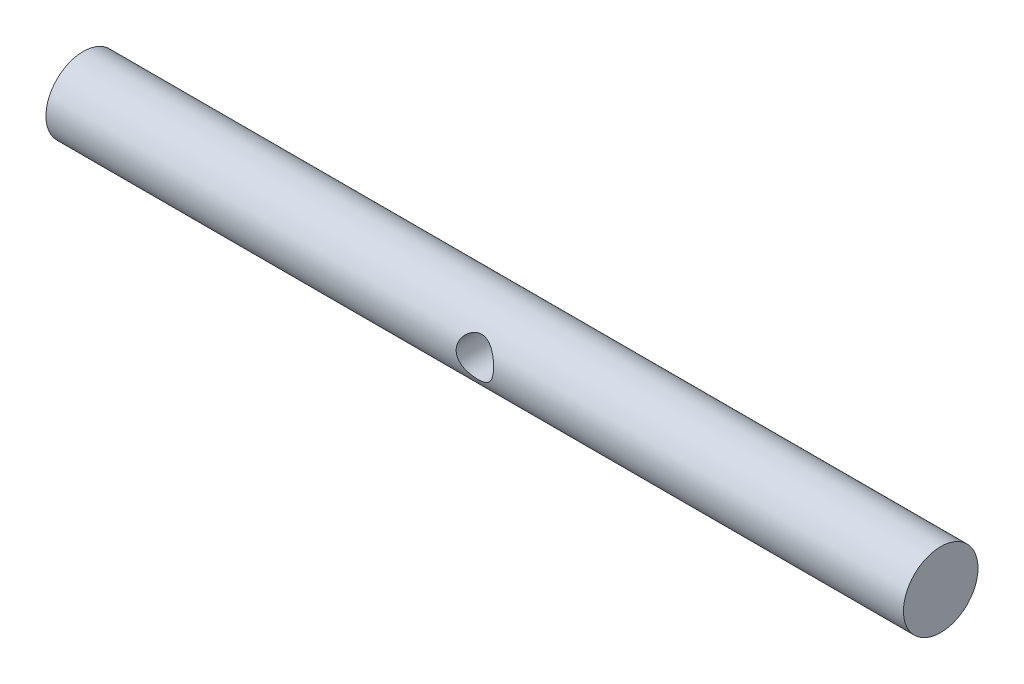
ISO-10303-21;
HEADER;
FILE_DESCRIPTION(('STEP AP214'),'2;1');
FILE_NAME('part.step','',(''),(''),'','','');
FILE_SCHEMA(('AUTOMOTIVE_DESIGN { 1 0 10303 214 1 1 1 1 }'));
ENDSEC;
DATA;
#1=APPLICATION_CONTEXT('core data for automotive mechanical design processes');
#2=APPLICATION_PROTOCOL_DEFINITION('international standard','automotive_design',2000,#1);
#3=PRODUCT_CONTEXT('',#1,'mechanical');
#4=PRODUCT('Part','Part','',(#3));
#5=PRODUCT_RELATED_PRODUCT_CATEGORY('part','',(#4));
#6=PRODUCT_DEFINITION_FORMATION('','',#4);
#7=PRODUCT_DEFINITION_CONTEXT('part definition',#1,'design');
#8=PRODUCT_DEFINITION('design','',#6,#7);
#9=PRODUCT_DEFINITION_SHAPE('','',#8);
#10=(LENGTH_UNIT() NAMED_UNIT(*) SI_UNIT(.MILLI.,.METRE.));
#11=(NAMED_UNIT(*) PLANE_ANGLE_UNIT() SI_UNIT($,.RADIAN.));
#12=(NAMED_UNIT(*) SI_UNIT($,.STERADIAN.) SOLID_ANGLE_UNIT());
#13=UNCERTAINTY_MEASURE_WITH_UNIT(LENGTH_MEASURE(1.E-05),#10,'distance_accuracy_value','');
#14=(GEOMETRIC_REPRESENTATION_CONTEXT(3) GLOBAL_UNCERTAINTY_ASSIGNED_CONTEXT((#13)) GLOBAL_UNIT_ASSIGNED_CONTEXT((#10,
#11,#12)) REPRESENTATION_CONTEXT('',''));
#15=CARTESIAN_POINT('',(0.,0.,0.));
#16=DIRECTION('',(0.,0.,1.));
#17=DIRECTION('',(1.,0.,0.));
#18=AXIS2_PLACEMENT_3D('',#15,#16,#17);
#19=CARTESIAN_POINT('',(292.1,0.,0.));
#20=DIRECTION('',(-1.,0.,0.));
#21=DIRECTION('',(0.,0.,1.));
#22=AXIS2_PLACEMENT_3D('',#19,#20,#21);
#23=CYLINDRICAL_SURFACE('',#22,12.7);
#24=CARTESIAN_POINT('',(292.1,0.,0.));
#25=DIRECTION('',(1.,0.,0.));
#26=DIRECTION('',(0.,0.,-1.));
#27=AXIS2_PLACEMENT_3D('',#24,#25,#26);
#28=CIRCLE('',#27,12.7);
#29=CARTESIAN_POINT('',(292.1,0.,-12.7));
#30=VERTEX_POINT('',#29);
#31=EDGE_CURVE('E45',#30,#30,#28,.T.);
#32=ORIENTED_EDGE('',*,*,#31,.F.);
#33=EDGE_LOOP('',(#32));
#34=FACE_BOUND('',#33,.T.);
#35=CARTESIAN_POINT('',(0.,0.,0.));
#36=DIRECTION('',(1.,0.,0.));
#37=DIRECTION('',(0.,0.,-1.));
#38=AXIS2_PLACEMENT_3D('',#35,#36,#37);
#39=CIRCLE('',#38,12.7);
#40=CARTESIAN_POINT('',(0.,0.,-12.7));
#41=VERTEX_POINT('',#40);
#42=EDGE_CURVE('E49',#41,#41,#39,.T.);
#43=ORIENTED_EDGE('',*,*,#42,.T.);
#44=EDGE_LOOP('',(#43));
#45=FACE_BOUND('',#44,.T.);
#46=CARTESIAN_POINT('',(139.7,1.08538215151732,-12.6535349047279));
#47=CARTESIAN_POINT('',(139.699999058588,1.25646176825175,-12.6388609941093));
#48=CARTESIAN_POINT('',(139.70692032353,1.42722969105797,-12.6207096198575));
#49=CARTESIAN_POINT('',(139.734375824096,1.76687071509261,-12.5776578390939));
#50=CARTESIAN_POINT('',(139.754914954132,1.93574311284878,-12.552755007937));
#51=CARTESIAN_POINT('',(139.809257875977,2.27046640398644,-12.4965523987587));
#52=CARTESIAN_POINT('',(139.843077966389,2.43631332175181,-12.4652447833871));
#53=CARTESIAN_POINT('',(139.923487510862,2.76370714120511,-12.3967701630305));
#54=CARTESIAN_POINT('',(139.970082295646,2.92525221684415,-12.3596007147315));
#55=CARTESIAN_POINT('',(140.075177707596,3.2421662403991,-12.2802643496551));
#56=CARTESIAN_POINT('',(140.133614935428,3.39756301904671,-12.2381245243026));
#57=CARTESIAN_POINT('',(140.261930880724,3.7022734361793,-12.1494198856163));
#58=CARTESIAN_POINT('',(140.33181392582,3.85158474699524,-12.1028534013802));
#59=CARTESIAN_POINT('',(140.557645827698,4.28915035614661,-11.9577314392459));
#60=CARTESIAN_POINT('',(140.729889473725,4.5673696903448,-11.853667592095));
#61=CARTESIAN_POINT('',(141.128494821462,5.11339035153208,-11.6291653413029));
#62=CARTESIAN_POINT('',(141.358106475696,5.37852986103786,-11.5080832984663));
#63=CARTESIAN_POINT('',(141.85831055401,5.86813403518078,-11.2663003604849));
#64=CARTESIAN_POINT('',(142.128951940971,6.09254938905842,-11.1456000990138));
#65=CARTESIAN_POINT('',(142.57319370311,6.40236453809394,-10.9688385481455));
#66=CARTESIAN_POINT('',(142.733969167335,6.50413800268986,-10.9086434463908));
#67=CARTESIAN_POINT('',(143.065509511409,6.69356744797531,-10.7934433388287));
#68=CARTESIAN_POINT('',(143.236275719228,6.78122154607838,-10.7384390255322));
#69=CARTESIAN_POINT('',(143.586535608247,6.9412214146403,-10.6357173124441));
#70=CARTESIAN_POINT('',(143.766012496931,7.01359530513945,-10.5879865730171));
#71=CARTESIAN_POINT('',(144.132783430647,7.14215478744586,-10.5016966706344));
#72=CARTESIAN_POINT('',(144.320074194415,7.19834709755201,-10.4631337025496));
#73=CARTESIAN_POINT('',(144.65191500754,7.28127898804023,-10.4055187679089));
#74=CARTESIAN_POINT('',(144.795084688892,7.31187641342039,-10.3839994871754));
#75=CARTESIAN_POINT('',(145.084016091308,7.36319141521831,-10.3476763793494));
#76=CARTESIAN_POINT('',(145.229777308477,7.38391089096306,-10.3328712612881));
#77=CARTESIAN_POINT('',(145.522831661649,7.4151762390694,-10.3104574459586));
#78=CARTESIAN_POINT('',(145.670123606514,7.42572949898278,-10.3028435230957));
#79=CARTESIAN_POINT('',(145.965289179661,7.43653427104488,-10.2950475252152));
#80=CARTESIAN_POINT('',(146.1131628271,7.43678544105009,-10.2948656970255));
#81=CARTESIAN_POINT('',(146.408384487388,7.42698078673234,-10.3019411799122));
#82=CARTESIAN_POINT('',(146.555732510265,7.41692516009823,-10.3091983483054));
#83=CARTESIAN_POINT('',(146.848891069014,7.38665186705136,-10.3309108377542));
#84=CARTESIAN_POINT('',(146.994701026558,7.36643050817495,-10.3453687743022));
#85=CARTESIAN_POINT('',(147.283796758901,7.31609415850435,-10.3810267013066));
#86=CARTESIAN_POINT('',(147.42708196844,7.28597698108476,-10.4022281818142));
#87=CARTESIAN_POINT('',(147.71028341073,7.21622728568895,-10.4507349506642));
#88=CARTESIAN_POINT('',(147.850198251585,7.17659090816081,-10.4780427144837));
#89=CARTESIAN_POINT('',(148.269356984494,7.04223127834882,-10.5692425645741));
#90=CARTESIAN_POINT('',(148.542278497657,6.93306903880465,-10.6416605640534));
#91=CARTESIAN_POINT('',(149.066683876073,6.68065527389482,-10.8019051461351));
#92=CARTESIAN_POINT('',(149.318159124681,6.53739013355012,-10.8897378791077));
#93=CARTESIAN_POINT('',(149.838575620001,6.19248844962348,-11.0900514930924));
#94=CARTESIAN_POINT('',(150.103082626866,5.98505054549135,-11.2041735129314));
#95=CARTESIAN_POINT('',(150.472391055174,5.64531945209747,-11.3770221347561));
#96=CARTESIAN_POINT('',(150.590995298866,5.52721639060334,-11.434958984279));
#97=CARTESIAN_POINT('',(150.818675037106,5.28183699240276,-11.5503486045928));
#98=CARTESIAN_POINT('',(150.927748987901,5.15455917560466,-11.6078012956011));
#99=CARTESIAN_POINT('',(151.148408387241,4.87538440541352,-11.728019538093));
#100=CARTESIAN_POINT('',(151.258695897222,4.72237327774461,-11.7905850255495));
#101=CARTESIAN_POINT('',(151.465718273364,4.40625158309779,-11.9123305790406));
#102=CARTESIAN_POINT('',(151.562458295024,4.24314489224927,-11.9715119278092));
#103=CARTESIAN_POINT('',(151.741527435836,3.90764480833735,-12.0851841725857));
#104=CARTESIAN_POINT('',(151.823857469098,3.73525200525397,-12.1396753660057));
#105=CARTESIAN_POINT('',(151.973149736251,3.38223064839425,-12.2427248578806));
#106=CARTESIAN_POINT('',(152.040113548062,3.20160294252527,-12.2912837652676));
#107=CARTESIAN_POINT('',(152.154515043351,2.84344456588062,-12.3788906807921));
#108=CARTESIAN_POINT('',(152.202818526259,2.66628232861992,-12.4183129818027));
#109=CARTESIAN_POINT('',(152.284094045361,2.30705167800183,-12.4900380045455));
#110=CARTESIAN_POINT('',(152.31706644124,2.12498337985213,-12.5223408932977));
#111=CARTESIAN_POINT('',(152.36703592871,1.75761257672613,-12.5791620238536));
#112=CARTESIAN_POINT('',(152.384045748106,1.5723127687011,-12.6036864574816));
#113=CARTESIAN_POINT('',(152.401697674792,1.20004426289545,-12.6445617291275));
#114=CARTESIAN_POINT('',(152.402341656527,1.01307575869113,-12.6609135029826));
#115=CARTESIAN_POINT('',(152.387962114627,0.66103913213102,-12.6838652243708));
#116=CARTESIAN_POINT('',(152.374752377032,0.495953381937054,-12.6913782803653));
#117=CARTESIAN_POINT('',(152.335440876267,0.167155086775483,-12.699964479703));
#118=CARTESIAN_POINT('',(152.309339498538,0.0034425009011298,-12.7010378155717));
#119=CARTESIAN_POINT('',(152.244436941604,-0.321342976151729,-12.696972722751));
#120=CARTESIAN_POINT('',(152.205637111969,-0.482416145933655,-12.6918349540113));
#121=CARTESIAN_POINT('',(152.115665396136,-0.800768740787728,-12.6757316724252));
#122=CARTESIAN_POINT('',(152.064493306734,-0.958048103503226,-12.6647660638581));
#123=CARTESIAN_POINT('',(151.951697690941,-1.26372787595315,-12.6378766310783));
#124=CARTESIAN_POINT('',(151.89037818376,-1.41225268922142,-12.6220881587506));
#125=CARTESIAN_POINT('',(151.75688378032,-1.70382905602177,-12.5860461348217));
#126=CARTESIAN_POINT('',(151.684705344932,-1.84687880599003,-12.5657911264864));
#127=CARTESIAN_POINT('',(151.530043894007,-2.12665093984209,-12.5214777837037));
#128=CARTESIAN_POINT('',(151.447562525519,-2.2633743302939,-12.497420057004));
#129=CARTESIAN_POINT('',(151.272836987151,-2.52984831467829,-12.4462167407825));
#130=CARTESIAN_POINT('',(151.180589290333,-2.65959636390869,-12.4190700354638));
#131=CARTESIAN_POINT('',(150.876264734325,-3.05531147349498,-12.3300987554821));
#132=CARTESIAN_POINT('',(150.647546015058,-3.3078096074722,-12.2640448097972));
#133=CARTESIAN_POINT('',(150.15310860536,-3.77283729391249,-12.1290779855081));
#134=CARTESIAN_POINT('',(149.88736865886,-3.98534371881649,-12.0601634805609));
#135=CARTESIAN_POINT('',(149.45573392871,-4.27712415956515,-11.9585871289887));
#136=CARTESIAN_POINT('',(149.300896909931,-4.37239060961225,-11.9239737770987));
#137=CARTESIAN_POINT('',(148.983189670612,-4.54950361399476,-11.8575275099868));
#138=CARTESIAN_POINT('',(148.820322617198,-4.63135540499225,-11.8256935120708));
#139=CARTESIAN_POINT('',(148.487529146433,-4.78098350355684,-11.7659973195571));
#140=CARTESIAN_POINT('',(148.31760214153,-4.84875863678995,-11.7381354563923));
#141=CARTESIAN_POINT('',(147.971924519568,-4.9695498505636,-11.6875090054282));
#142=CARTESIAN_POINT('',(147.796176876459,-5.02257334187556,-11.6647418593286));
#143=CARTESIAN_POINT('',(147.446590169246,-5.11166377665286,-11.625969616844));
#144=CARTESIAN_POINT('',(147.272914610743,-5.14827782792358,-11.6097484914877));
#145=CARTESIAN_POINT('',(146.922640098189,-5.20687701544083,-11.5835860719854));
#146=CARTESIAN_POINT('',(146.746041211848,-5.22886249003133,-11.573644632597));
#147=CARTESIAN_POINT('',(146.391454684579,-5.25792440263254,-11.5604708825107));
#148=CARTESIAN_POINT('',(146.213467747353,-5.26500795762355,-11.557235369153));
#149=CARTESIAN_POINT('',(145.857540530337,-5.26419464797943,-11.5576060211768));
#150=CARTESIAN_POINT('',(145.679600248537,-5.25629859767533,-11.5612118146468));
#151=CARTESIAN_POINT('',(145.339142413559,-5.22683272849919,-11.5745605072883));
#152=CARTESIAN_POINT('',(145.176506846012,-5.2063803589639,-11.5838014909588));
#153=CARTESIAN_POINT('',(144.85362833012,-5.15304526526499,-11.6076258205371));
#154=CARTESIAN_POINT('',(144.693386221904,-5.12015827827697,-11.6222109984838));
#155=CARTESIAN_POINT('',(144.37643322648,-5.04228486137974,-11.6562071057344));
#156=CARTESIAN_POINT('',(144.219721679923,-4.9973007113193,-11.6756171256896));
#157=CARTESIAN_POINT('',(143.910679125405,-4.8956111351211,-11.7186192414251));
#158=CARTESIAN_POINT('',(143.758349840802,-4.83890116759755,-11.7422129570367));
#159=CARTESIAN_POINT('',(143.455174159264,-4.71263674452147,-11.7934647744982));
#160=CARTESIAN_POINT('',(143.304463083338,-4.64279329808658,-11.8212106966854));
#161=CARTESIAN_POINT('',(143.009337029036,-4.49174605978223,-11.8794262297872));
#162=CARTESIAN_POINT('',(142.864924194223,-4.41053843916492,-11.9098967574047));
#163=CARTESIAN_POINT('',(142.583135586533,-4.23727809451635,-11.9726338706395));
#164=CARTESIAN_POINT('',(142.44576105698,-4.14522346376009,-12.004900771502));
#165=CARTESIAN_POINT('',(142.178732180779,-3.95079355199925,-12.0702837237745));
#166=CARTESIAN_POINT('',(142.049078180803,-3.84841780810282,-12.1033998132201));
#167=CARTESIAN_POINT('',(141.787570064113,-3.62484245180462,-12.172317877567));
#168=CARTESIAN_POINT('',(141.656446657165,-3.50278394133403,-12.2081116996342));
#169=CARTESIAN_POINT('',(141.404848866331,-3.24787660758743,-12.2783862565313));
#170=CARTESIAN_POINT('',(141.284371121168,-3.11503121578106,-12.3128674038557));
#171=CARTESIAN_POINT('',(141.054722970472,-2.83914853407703,-12.3793933999808));
#172=CARTESIAN_POINT('',(140.945561088027,-2.69610369688878,-12.4114364076162));
#173=CARTESIAN_POINT('',(140.739502563478,-2.40080706610559,-12.4719214984859));
#174=CARTESIAN_POINT('',(140.642600432215,-2.24855943839757,-12.5003651932713));
#175=CARTESIAN_POINT('',(140.461791194214,-1.93572122261397,-12.5526145765845));
#176=CARTESIAN_POINT('',(140.377886742079,-1.77512893917451,-12.5764193179237));
#177=CARTESIAN_POINT('',(140.223911035826,-1.44681903178088,-12.6184025962075));
#178=CARTESIAN_POINT('',(140.153833292123,-1.27910479565907,-12.6365837748648));
#179=CARTESIAN_POINT('',(140.028268389652,-0.938034702975049,-12.6664653010566));
#180=CARTESIAN_POINT('',(139.972758182519,-0.764688251977399,-12.6781759189952));
#181=CARTESIAN_POINT('',(139.876786320436,-0.413627933991911,-12.6944780804253));
#182=CARTESIAN_POINT('',(139.836318028698,-0.235916030114306,-12.6990727664463));
#183=CARTESIAN_POINT('',(139.769096436273,0.131724953647658,-12.7007152330126));
#184=CARTESIAN_POINT('',(139.74316883359,0.321807708013341,-12.6973567664083));
#185=CARTESIAN_POINT('',(139.708621623083,0.703183777761195,-12.681953556312));
#186=CARTESIAN_POINT('',(139.700001050507,0.894477025069995,-12.6699092970466));
#187=CARTESIAN_POINT('',(139.7,1.08538215151732,-12.6535349047279));
#188=B_SPLINE_CURVE_WITH_KNOTS('',3,(#46,#47,#48,#49,#50,#51,#52,#53,#54,#55,#56,#57,#58,#59,
#60,#61,#62,#63,#64,#65,#66,#67,#68,#69,#70,#71,#72,#73,#74,#75,#76,#77,#78,#79,#80,#81,#82,#83,
#84,#85,#86,#87,#88,#89,#90,#91,#92,#93,#94,#95,#96,#97,#98,#99,#100,#101,#102,#103,#104,#105,
#106,#107,#108,#109,#110,#111,#112,#113,#114,#115,#116,#117,#118,#119,#120,#121,#122,#123,#124,
#125,#126,#127,#128,#129,#130,#131,#132,#133,#134,#135,#136,#137,#138,#139,#140,#141,#142,#143,
#144,#145,#146,#147,#148,#149,#150,#151,#152,#153,#154,#155,#156,#157,#158,#159,#160,#161,#162,
#163,#164,#165,#166,#167,#168,#169,#170,#171,#172,#173,#174,#175,#176,#177,#178,#179,#180,#181,
#182,#183,#184,#185,#186,#187),.UNSPECIFIED.,.T.,.F.,(4,2,2,2,2,2,2,2,2,2,2,2,2,2,2,2,2,2,2,2,2,
2,2,2,2,2,2,2,2,2,2,2,2,2,2,2,2,2,2,2,2,2,2,2,2,2,2,2,2,2,2,2,2,2,2,2,2,2,2,2,2,2,2,2,2,2,2,2,2,
2,4),(0.,0.514929922817684,1.03004501751136,1.54579425509279,2.06175903689908,2.57503126515763,
3.08849801014489,4.11435744771403,5.22317389479882,6.33332411947669,6.93137609808496,
7.52950775125027,8.12652888365933,8.72330178515826,9.1667669107734,9.61014673272144,
10.0532041173114,10.4962762163025,10.9393398171374,11.3825644668303,11.8258871194081,
12.2693898211474,13.1738214187293,14.0786147019881,15.1390160182444,15.6699950060196,
16.2010598450234,16.796491891663,17.3916967271403,17.9868637916195,18.5819697124743,
19.1446168169328,19.7072507203986,20.2694356240689,20.8315561381533,21.328288797718,
21.8250066066157,22.321671642293,22.818344835816,23.3021921034881,23.7861974090912,
24.2701254393888,24.7542288318152,25.7906284701389,26.8276256379943,27.3822351065522,
27.9366275546097,28.4910662338562,29.0452258751214,29.5792080344683,30.1131778429263,
30.6468925757809,31.1805782953206,31.6725342879872,32.1646590857055,32.6566912017948,
33.1489142390921,33.6536065506376,34.158469311241,34.6634209511346,35.1683952476991,
35.7158049414879,36.2630411731476,36.8106866322779,37.3580860152458,37.9055970502298,
38.4528504956221,38.9992327986783,39.5453737401487,40.1200081945248,40.6946106159203),.UNSPECIFIED.);
#189=CARTESIAN_POINT('',(139.7,1.08538215151732,-12.6535349047279));
#190=VERTEX_POINT('',#189);
#191=EDGE_CURVE('E41',#190,#190,#188,.T.);
#192=ORIENTED_EDGE('',*,*,#191,.F.);
#193=EDGE_LOOP('',(#192));
#194=FACE_BOUND('',#193,.T.);
#195=CARTESIAN_POINT('',(152.306552212295,0.,12.7));
#196=CARTESIAN_POINT('',(152.334700623203,0.162236592722388,12.7000030640305));
#197=CARTESIAN_POINT('',(152.356521378705,0.325533019675201,12.6968862853893));
#198=CARTESIAN_POINT('',(152.387405964591,0.653131735609564,12.6842526821182));
#199=CARTESIAN_POINT('',(152.396467558863,0.817434195837741,12.6747347360801));
#200=CARTESIAN_POINT('',(152.401837067429,1.14582193933535,12.6492780850251));
#201=CARTESIAN_POINT('',(152.398138800699,1.30990707882184,12.6333362715157));
#202=CARTESIAN_POINT('',(152.378145029596,1.63663313089962,12.5951773746725));
#203=CARTESIAN_POINT('',(152.361844698317,1.79927346594513,12.5729578889029));
#204=CARTESIAN_POINT('',(152.317020436891,2.121391452561,12.5226271181832));
#205=CARTESIAN_POINT('',(152.288535353894,2.28087748415784,12.4945347014834));
#206=CARTESIAN_POINT('',(152.219752831016,2.59624679636991,12.4328329646262));
#207=CARTESIAN_POINT('',(152.17945093255,2.7521286931207,12.3992215642201));
#208=CARTESIAN_POINT('',(152.087541802735,3.05927948037799,12.3270303768432));
#209=CARTESIAN_POINT('',(152.035938511176,3.21054995759239,12.2884523232293));
#210=CARTESIAN_POINT('',(151.921954047385,3.50778337677052,12.2069349415007));
#211=CARTESIAN_POINT('',(151.859568685231,3.65374422861784,12.1639939206165));
#212=CARTESIAN_POINT('',(151.650413152256,4.09665149586383,12.0252206009894));
#213=CARTESIAN_POINT('',(151.486146430531,4.3835833797958,11.9230409831846));
#214=CARTESIAN_POINT('',(151.117340234556,4.92628228831378,11.7092759098496));
#215=CARTESIAN_POINT('',(150.912769880429,5.18202517169971,11.5976832799747));
#216=CARTESIAN_POINT('',(150.440967344259,5.68700438554076,11.3593446784612));
#217=CARTESIAN_POINT('',(150.169188549667,5.93190753659263,11.232365171534));
#218=CARTESIAN_POINT('',(149.584922592777,6.3731837103111,10.9880022728527));
#219=CARTESIAN_POINT('',(149.272448493898,6.56957224808513,10.8706158212705));
#220=CARTESIAN_POINT('',(148.664911582231,6.88032766457609,10.6761047278836));
#221=CARTESIAN_POINT('',(148.375160440716,7.00281287639312,10.5955402617548));
#222=CARTESIAN_POINT('',(147.925660582857,7.15410927398859,10.4934453040377));
#223=CARTESIAN_POINT('',(147.773351464819,7.19913562414628,10.4625393494963));
#224=CARTESIAN_POINT('',(147.464596545259,7.27785808992041,10.4079338843601));
#225=CARTESIAN_POINT('',(147.308152614561,7.31155923814394,10.3842311732919));
#226=CARTESIAN_POINT('',(146.991110257039,7.36733218454387,10.3447376073858));
#227=CARTESIAN_POINT('',(146.8304909445,7.38932412140631,10.3290011201564));
#228=CARTESIAN_POINT('',(146.507416373196,7.42096491450147,10.3062924004771));
#229=CARTESIAN_POINT('',(146.344961126043,7.43061384875769,10.2993201126261));
#230=CARTESIAN_POINT('',(146.01967842759,7.43739290715418,10.2944259066388));
#231=CARTESIAN_POINT('',(145.856851039666,7.43452502417955,10.2965025477627));
#232=CARTESIAN_POINT('',(145.532268956761,7.41632798597875,10.3096170502591));
#233=CARTESIAN_POINT('',(145.370514202496,7.40099952532777,10.3206544121447));
#234=CARTESIAN_POINT('',(145.065858511091,7.36034129767476,10.3496824522322));
#235=CARTESIAN_POINT('',(144.92271892561,7.33619257323415,10.3668480553978));
#236=CARTESIAN_POINT('',(144.639270247737,7.27838549648603,10.4075137361015));
#237=CARTESIAN_POINT('',(144.49896211051,7.24472399073518,10.4310159140662));
#238=CARTESIAN_POINT('',(144.083495369483,7.13003130909849,10.510059512324));
#239=CARTESIAN_POINT('',(143.813626200313,7.03526895892072,10.574155256864));
#240=CARTESIAN_POINT('',(143.271152072536,6.80332022550723,10.724989089653));
#241=CARTESIAN_POINT('',(143.000205841676,6.66324864654132,10.8131724906852));
#242=CARTESIAN_POINT('',(142.483879260984,6.34816463124455,11.0011146762057));
#243=CARTESIAN_POINT('',(142.238514153915,6.17313154181384,11.1008802880901));
#244=CARTESIAN_POINT('',(141.7342372793,5.75676690221137,11.3231907830523));
#245=CARTESIAN_POINT('',(141.480815609511,5.5091736538607,11.4466072717256));
#246=CARTESIAN_POINT('',(141.133585261905,5.10815754443565,11.6283461779945));
#247=CARTESIAN_POINT('',(141.023260602426,4.96944157342661,11.6884018767164));
#248=CARTESIAN_POINT('',(140.814140193082,4.68256978887577,11.8062502094593));
#249=CARTESIAN_POINT('',(140.715346053641,4.53441266117962,11.8640425266151));
#250=CARTESIAN_POINT('',(140.524363654293,4.21998403410767,11.9796283082597));
#251=CARTESIAN_POINT('',(140.432953598787,4.05315885941536,12.0372039103619));
#252=CARTESIAN_POINT('',(140.264950119374,3.71065473678247,12.1471546393432));
#253=CARTESIAN_POINT('',(140.188349822384,3.53497994382258,12.1995321730819));
#254=CARTESIAN_POINT('',(140.050914240991,3.17593227446782,12.2978892676411));
#255=CARTESIAN_POINT('',(139.990071066653,2.99256330437344,12.3438720251041));
#256=CARTESIAN_POINT('',(139.885044331799,2.61945026069188,12.428396820351));
#257=CARTESIAN_POINT('',(139.84085834218,2.42970712104349,12.4669399426507));
#258=CARTESIAN_POINT('',(139.77342338485,2.06424475250864,12.5323551612578));
#259=CARTESIAN_POINT('',(139.748553242248,1.88896167387101,12.5599987342589));
#260=CARTESIAN_POINT('',(139.71352262445,1.53594520558331,12.608036804267));
#261=CARTESIAN_POINT('',(139.703361225033,1.35821197059704,12.6284317566795));
#262=CARTESIAN_POINT('',(139.698050467153,1.00190652118893,12.6616817407076));
#263=CARTESIAN_POINT('',(139.702893534482,0.823334775487561,12.6745405726366));
#264=CARTESIAN_POINT('',(139.727671004181,0.466858637848223,12.6926705660968));
#265=CARTESIAN_POINT('',(139.747604459648,0.288954204741097,12.6979422036549));
#266=CARTESIAN_POINT('',(139.799800155141,-0.0476048508186092,12.7009167304008));
#267=CARTESIAN_POINT('',(139.830695095839,-0.206467860816363,12.6992976479048));
#268=CARTESIAN_POINT('',(139.904488483502,-0.521270015693279,12.6902749673324));
#269=CARTESIAN_POINT('',(139.947390951144,-0.677208162498032,12.6828694301912));
#270=CARTESIAN_POINT('',(140.044823940957,-0.984981980253566,12.6626848929034));
#271=CARTESIAN_POINT('',(140.099350256312,-1.13681911307251,12.6499078351548));
#272=CARTESIAN_POINT('',(140.219615699696,-1.43554180479788,12.6194997423117));
#273=CARTESIAN_POINT('',(140.285359117887,-1.58242544332102,12.6018668484335));
#274=CARTESIAN_POINT('',(140.428606582244,-1.87248608293098,12.5620674803544));
#275=CARTESIAN_POINT('',(140.506271976735,-2.0155746583038,12.5398370798241));
#276=CARTESIAN_POINT('',(140.672055894907,-2.29494778890796,12.4917309145283));
#277=CARTESIAN_POINT('',(140.760178208843,-2.43122985143659,12.4658538273293));
#278=CARTESIAN_POINT('',(141.03933633136,-2.82875973490824,12.3839076268728));
#279=CARTESIAN_POINT('',(141.245245677441,-3.0788570685993,12.3234993586771));
#280=CARTESIAN_POINT('',(141.710805709893,-3.56394453824364,12.1924876671306));
#281=CARTESIAN_POINT('',(141.973524669869,-3.7958802937151,12.1214540825476));
#282=CARTESIAN_POINT('',(142.393664202169,-4.1092638479122,12.0173259597263));
#283=CARTESIAN_POINT('',(142.538166706314,-4.20802983197621,11.9829966562923));
#284=CARTESIAN_POINT('',(142.835135408423,-4.3934635478192,11.9162567137965));
#285=CARTESIAN_POINT('',(142.987598660992,-4.48013571120787,11.8838453744443));
#286=CARTESIAN_POINT('',(143.305753807753,-4.64391702301662,11.8208308259807));
#287=CARTESIAN_POINT('',(143.471729758719,-4.72052093997281,11.7903475499521));
#288=CARTESIAN_POINT('',(143.810257187795,-4.85932113407058,11.7338235479072));
#289=CARTESIAN_POINT('',(143.982805745994,-4.9215237241111,11.7077808766523));
#290=CARTESIAN_POINT('',(144.333249402186,-5.03090302828655,11.6611985989975));
#291=CARTESIAN_POINT('',(144.51114208098,-5.07808643246097,11.6406565430917));
#292=CARTESIAN_POINT('',(144.870946603299,-5.15691236403163,11.6059518039563));
#293=CARTESIAN_POINT('',(145.05285806896,-5.18855634606862,11.5917885236216));
#294=CARTESIAN_POINT('',(145.406442985626,-5.2342598674783,11.5712187510329));
#295=CARTESIAN_POINT('',(145.577951788276,-5.24938649230653,11.5643425333114));
#296=CARTESIAN_POINT('',(145.921766119048,-5.26565471355812,11.5569443781528));
#297=CARTESIAN_POINT('',(146.09407160985,-5.26679695855976,11.5564221460257));
#298=CARTESIAN_POINT('',(146.438079217096,-5.25508407587478,11.5617529440992));
#299=CARTESIAN_POINT('',(146.609781416333,-5.24223095064812,11.5676050622567));
#300=CARTESIAN_POINT('',(146.951257170109,-5.2026841275057,11.5854454714424));
#301=CARTESIAN_POINT('',(147.121030747775,-5.17599059573692,11.5974336888098));
#302=CARTESIAN_POINT('',(147.44864499386,-5.11080426578338,11.626301064003));
#303=CARTESIAN_POINT('',(147.606647826207,-5.07299536773899,11.6428942520301));
#304=CARTESIAN_POINT('',(147.918844462538,-4.98554949144492,11.6806062425374));
#305=CARTESIAN_POINT('',(148.073036935327,-4.93590844220953,11.7017266023899));
#306=CARTESIAN_POINT('',(148.376657258416,-4.82522402030759,11.7477998983918));
#307=CARTESIAN_POINT('',(148.526085832583,-4.76418238970291,11.7727522488919));
#308=CARTESIAN_POINT('',(148.819442079146,-4.63114326661818,11.8257192230209));
#309=CARTESIAN_POINT('',(148.963367722492,-4.55914178082611,11.853734961768));
#310=CARTESIAN_POINT('',(149.403143610879,-4.31786424367004,11.9447395390439));
#311=CARTESIAN_POINT('',(149.688272094337,-4.13008594724266,12.0117003681974));
#312=CARTESIAN_POINT('',(150.224711743781,-3.71150629778138,12.1475510864565));
#313=CARTESIAN_POINT('',(150.475999645979,-3.48067560564993,12.2164422636759));
#314=CARTESIAN_POINT('',(150.831102978614,-3.09752208992545,12.317242118852));
#315=CARTESIAN_POINT('',(150.949097329757,-2.95870080270827,12.3514324906725));
#316=CARTESIAN_POINT('',(151.173007985765,-2.67100956361806,12.4168206010507));
#317=CARTESIAN_POINT('',(151.278928896624,-2.52214347855366,12.4480194801309));
#318=CARTESIAN_POINT('',(151.477756809596,-2.21542412981703,12.5062477539999));
#319=CARTESIAN_POINT('',(151.57067813262,-2.05758102968871,12.5332817403938));
#320=CARTESIAN_POINT('',(151.742788801437,-1.73388238162196,12.5821478835985));
#321=CARTESIAN_POINT('',(151.821982731334,-1.56802953219418,12.6039817778345));
#322=CARTESIAN_POINT('',(151.988905973353,-1.175320402832,12.647492579637));
#323=CARTESIAN_POINT('',(152.071280059242,-0.945901843828015,12.6668911428049));
#324=CARTESIAN_POINT('',(152.209248677034,-0.478430473805908,12.6931419303231));
#325=CARTESIAN_POINT('',(152.264845995004,-0.240378563842527,12.6999954601656));
#326=CARTESIAN_POINT('',(152.306552212295,0.,12.7));
#327=B_SPLINE_CURVE_WITH_KNOTS('',3,(#195,#196,#197,#198,#199,#200,#201,#202,#203,#204,#205,
#206,#207,#208,#209,#210,#211,#212,#213,#214,#215,#216,#217,#218,#219,#220,#221,#222,#223,#224,
#225,#226,#227,#228,#229,#230,#231,#232,#233,#234,#235,#236,#237,#238,#239,#240,#241,#242,#243,
#244,#245,#246,#247,#248,#249,#250,#251,#252,#253,#254,#255,#256,#257,#258,#259,#260,#261,#262,
#263,#264,#265,#266,#267,#268,#269,#270,#271,#272,#273,#274,#275,#276,#277,#278,#279,#280,#281,
#282,#283,#284,#285,#286,#287,#288,#289,#290,#291,#292,#293,#294,#295,#296,#297,#298,#299,#300,
#301,#302,#303,#304,#305,#306,#307,#308,#309,#310,#311,#312,#313,#314,#315,#316,#317,#318,#319,
#320,#321,#322,#323,#324,#325,#326),.UNSPECIFIED.,.T.,.F.,(4,2,2,2,2,2,2,2,2,2,2,2,2,2,2,2,2,2,
2,2,2,2,2,2,2,2,2,2,2,2,2,2,2,2,2,2,2,2,2,2,2,2,2,2,2,2,2,2,2,2,2,2,2,2,2,2,2,2,2,2,2,2,2,2,2,
4),(0.,0.493760608070044,0.987607739649199,1.48169413007869,1.97596986177683,2.46868136414256,
2.96157901043012,3.45430509992355,3.94722309552388,4.98085783803366,6.01528763347443,
7.17184885400544,8.32803972283793,9.29787213775265,9.78276997799786,10.2674520572125,
10.7553988292191,11.2433425167652,11.7312085184101,12.2190473273846,12.6570733721761,
13.0952447912614,13.9710813495612,14.9201654222011,15.8698118221011,16.9901234274146,
17.5510557907899,18.1120664039768,18.7075276627667,19.3027119061999,19.8975975491617,
20.4923964068359,21.0292092154066,21.5659882919443,22.102496448196,22.6389709420171,
23.1239429120317,23.6090774678761,24.0940367446728,24.5791819194938,25.071590950451,
25.5641790102096,26.5488011648656,27.6164876286183,28.1510946410362,28.6855052369039,
29.240772429692,29.7957957553176,30.3505715082132,30.9052953188087,31.4215577081741,
31.9377961538364,32.4539607457183,32.9701191414523,33.459502511847,33.9490545038082,
34.4385317510605,34.9281877721111,35.9672248948474,37.0069726990539,37.5625030913194,
38.1178208354396,38.6725219171506,39.2270374044919,39.9586961332831,40.690278718064),.UNSPECIFIED.);
#328=CARTESIAN_POINT('',(152.306552212295,0.,12.7));
#329=VERTEX_POINT('',#328);
#330=EDGE_CURVE('E10',#329,#329,#327,.T.);
#331=ORIENTED_EDGE('',*,*,#330,.F.);
#332=EDGE_LOOP('',(#331));
#333=FACE_BOUND('',#332,.T.);
#334=ADVANCED_FACE('F31',(#34,#45,#194,#333),#23,.T.);
#335=CARTESIAN_POINT('',(292.1,0.,0.));
#336=DIRECTION('',(1.,0.,0.));
#337=DIRECTION('',(0.,0.,-1.));
#338=AXIS2_PLACEMENT_3D('',#335,#336,#337);
#339=PLANE('',#338);
#340=ORIENTED_EDGE('',*,*,#31,.T.);
#341=EDGE_LOOP('',(#340));
#342=FACE_BOUND('',#341,.T.);
#343=ADVANCED_FACE('F59',(#342),#339,.T.);
#344=CARTESIAN_POINT('',(0.,0.,0.));
#345=DIRECTION('',(1.,0.,0.));
#346=DIRECTION('',(0.,0.,-1.));
#347=AXIS2_PLACEMENT_3D('',#344,#345,#346);
#348=PLANE('',#347);
#349=ORIENTED_EDGE('',*,*,#42,.F.);
#350=EDGE_LOOP('',(#349));
#351=FACE_BOUND('',#350,.T.);
#352=ADVANCED_FACE('F58',(#351),#348,.F.);
#353=CARTESIAN_POINT('',(146.05,1.08538215151732,12.7));
#354=DIRECTION('',(0.,0.,-1.));
#355=DIRECTION('',(-1.,0.,0.));
#356=AXIS2_PLACEMENT_3D('',#353,#354,#355);
#357=CYLINDRICAL_SURFACE('',#356,6.35);
#358=ORIENTED_EDGE('',*,*,#191,.T.);
#359=EDGE_LOOP('',(#358));
#360=FACE_BOUND('',#359,.T.);
#361=ORIENTED_EDGE('',*,*,#330,.T.);
#362=EDGE_LOOP('',(#361));
#363=FACE_BOUND('',#362,.T.);
#364=ADVANCED_FACE('F54',(#360,#363),#357,.F.);
#365=CLOSED_SHELL('',(#334,#343,#352,#364));
#366=MANIFOLD_SOLID_BREP('B2',#365);
#367=ADVANCED_BREP_SHAPE_REPRESENTATION('',(#18,#366),#14);
#368=SHAPE_DEFINITION_REPRESENTATION(#9,#367);
ENDSEC;
END-ISO-10303-21;
